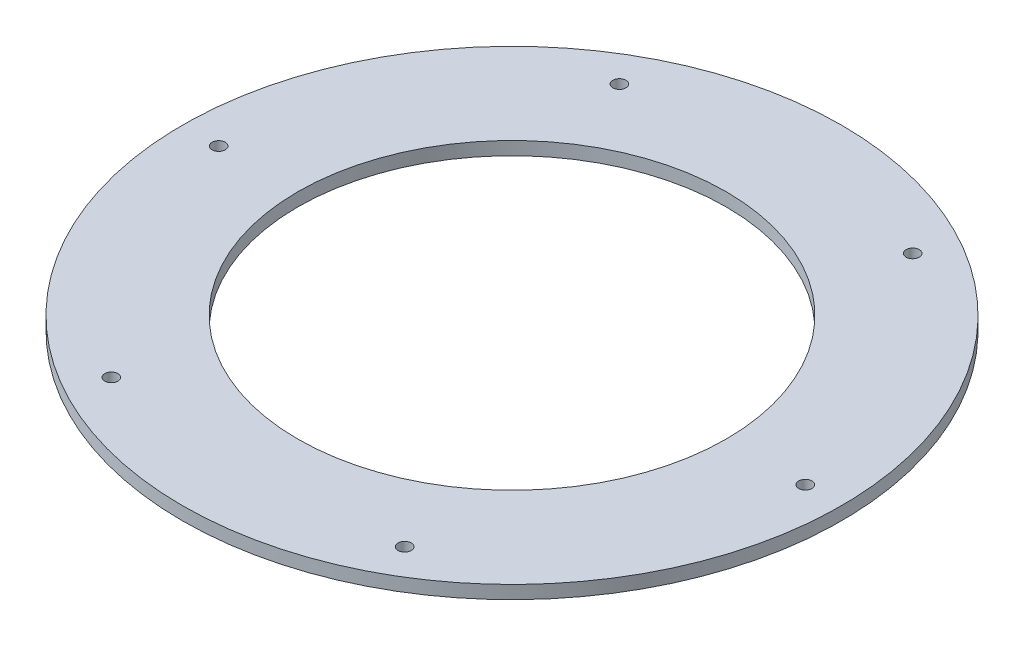
ISO-10303-21;
HEADER;
FILE_DESCRIPTION(('STEP AP214'),'2;1');
FILE_NAME('part.step','',(''),(''),'','','');
FILE_SCHEMA(('AUTOMOTIVE_DESIGN { 1 0 10303 214 1 1 1 1 }'));
ENDSEC;
DATA;
#1=APPLICATION_CONTEXT('core data for automotive mechanical design processes');
#2=APPLICATION_PROTOCOL_DEFINITION('international standard','automotive_design',2000,#1);
#3=PRODUCT_CONTEXT('',#1,'mechanical');
#4=PRODUCT('Part','Part','',(#3));
#5=PRODUCT_RELATED_PRODUCT_CATEGORY('part','',(#4));
#6=PRODUCT_DEFINITION_FORMATION('','',#4);
#7=PRODUCT_DEFINITION_CONTEXT('part definition',#1,'design');
#8=PRODUCT_DEFINITION('design','',#6,#7);
#9=PRODUCT_DEFINITION_SHAPE('','',#8);
#10=(LENGTH_UNIT() NAMED_UNIT(*) SI_UNIT(.MILLI.,.METRE.));
#11=(NAMED_UNIT(*) PLANE_ANGLE_UNIT() SI_UNIT($,.RADIAN.));
#12=(NAMED_UNIT(*) SI_UNIT($,.STERADIAN.) SOLID_ANGLE_UNIT());
#13=UNCERTAINTY_MEASURE_WITH_UNIT(LENGTH_MEASURE(1.E-05),#10,'distance_accuracy_value','');
#14=(GEOMETRIC_REPRESENTATION_CONTEXT(3) GLOBAL_UNCERTAINTY_ASSIGNED_CONTEXT((#13)) GLOBAL_UNIT_ASSIGNED_CONTEXT((#10,
#11,#12)) REPRESENTATION_CONTEXT('',''));
#15=CARTESIAN_POINT('',(0.,0.,0.));
#16=DIRECTION('',(0.,0.,1.));
#17=DIRECTION('',(1.,0.,0.));
#18=AXIS2_PLACEMENT_3D('',#15,#16,#17);
#19=CARTESIAN_POINT('',(0.,5.,0.));
#20=DIRECTION('',(0.,1.,0.));
#21=DIRECTION('',(0.,0.,1.));
#22=AXIS2_PLACEMENT_3D('',#19,#20,#21);
#23=PLANE('',#22);
#24=CARTESIAN_POINT('',(111.25,5.,192.690652342038));
#25=DIRECTION('',(0.,1.,0.));
#26=DIRECTION('',(0.,0.,-1.));
#27=AXIS2_PLACEMENT_3D('',#24,#25,#26);
#28=CIRCLE('',#27,5.00000000000002);
#29=CARTESIAN_POINT('',(111.25,5.,187.690652342038));
#30=VERTEX_POINT('',#29);
#31=EDGE_CURVE('E89',#30,#30,#28,.T.);
#32=ORIENTED_EDGE('',*,*,#31,.F.);
#33=EDGE_LOOP('',(#32));
#34=FACE_BOUND('',#33,.T.);
#35=CARTESIAN_POINT('',(-222.5,5.,1.55431223447522E-12));
#36=DIRECTION('',(0.,1.,0.));
#37=DIRECTION('',(0.,0.,-1.));
#38=AXIS2_PLACEMENT_3D('',#35,#36,#37);
#39=CIRCLE('',#38,4.99999999999993);
#40=CARTESIAN_POINT('',(-222.5,5.,-4.99999999999837));
#41=VERTEX_POINT('',#40);
#42=EDGE_CURVE('E98',#41,#41,#39,.T.);
#43=ORIENTED_EDGE('',*,*,#42,.F.);
#44=EDGE_LOOP('',(#43));
#45=FACE_BOUND('',#44,.T.);
#46=CARTESIAN_POINT('',(-111.250000000001,5.,-192.690652342037));
#47=DIRECTION('',(0.,1.,0.));
#48=DIRECTION('',(0.,0.,-1.));
#49=AXIS2_PLACEMENT_3D('',#46,#47,#48);
#50=CIRCLE('',#49,5.00000000000002);
#51=CARTESIAN_POINT('',(-111.250000000001,5.,-197.690652342037));
#52=VERTEX_POINT('',#51);
#53=EDGE_CURVE('E73',#52,#52,#50,.T.);
#54=ORIENTED_EDGE('',*,*,#53,.F.);
#55=EDGE_LOOP('',(#54));
#56=FACE_BOUND('',#55,.T.);
#57=CARTESIAN_POINT('',(222.5,5.,0.));
#58=DIRECTION('',(0.,1.,0.));
#59=DIRECTION('',(0.,0.,1.));
#60=AXIS2_PLACEMENT_3D('',#57,#58,#59);
#61=CIRCLE('',#60,4.99999999999999);
#62=CARTESIAN_POINT('',(222.5,5.,4.99999999999999));
#63=VERTEX_POINT('',#62);
#64=EDGE_CURVE('E82',#63,#63,#61,.T.);
#65=ORIENTED_EDGE('',*,*,#64,.F.);
#66=EDGE_LOOP('',(#65));
#67=FACE_BOUND('',#66,.T.);
#68=CARTESIAN_POINT('',(-111.250000000001,5.,192.690652342037));
#69=DIRECTION('',(0.,1.,0.));
#70=DIRECTION('',(0.,0.,1.));
#71=AXIS2_PLACEMENT_3D('',#68,#69,#70);
#72=CIRCLE('',#71,5.00000000000002);
#73=CARTESIAN_POINT('',(-111.250000000001,5.,197.690652342037));
#74=VERTEX_POINT('',#73);
#75=EDGE_CURVE('E105',#74,#74,#72,.T.);
#76=ORIENTED_EDGE('',*,*,#75,.F.);
#77=EDGE_LOOP('',(#76));
#78=FACE_BOUND('',#77,.T.);
#79=CARTESIAN_POINT('',(111.25,5.,-192.690652342038));
#80=DIRECTION('',(0.,1.,0.));
#81=DIRECTION('',(0.,0.,1.));
#82=AXIS2_PLACEMENT_3D('',#79,#80,#81);
#83=CIRCLE('',#82,5.00000000000002);
#84=CARTESIAN_POINT('',(111.25,5.,-187.690652342038));
#85=VERTEX_POINT('',#84);
#86=EDGE_CURVE('E65',#85,#85,#83,.T.);
#87=ORIENTED_EDGE('',*,*,#86,.F.);
#88=EDGE_LOOP('',(#87));
#89=FACE_BOUND('',#88,.T.);
#90=CARTESIAN_POINT('',(0.,5.,0.));
#91=DIRECTION('',(0.,1.,0.));
#92=DIRECTION('',(0.,0.,1.));
#93=AXIS2_PLACEMENT_3D('',#90,#91,#92);
#94=CIRCLE('',#93,250.);
#95=CARTESIAN_POINT('',(0.,5.,250.));
#96=VERTEX_POINT('',#95);
#97=EDGE_CURVE('E10',#96,#96,#94,.T.);
#98=ORIENTED_EDGE('',*,*,#97,.T.);
#99=EDGE_LOOP('',(#98));
#100=FACE_BOUND('',#99,.T.);
#101=CARTESIAN_POINT('',(0.,5.,0.));
#102=DIRECTION('',(0.,1.,0.));
#103=DIRECTION('',(0.,0.,1.));
#104=AXIS2_PLACEMENT_3D('',#101,#102,#103);
#105=CIRCLE('',#104,162.5);
#106=CARTESIAN_POINT('',(0.,5.,162.5));
#107=VERTEX_POINT('',#106);
#108=EDGE_CURVE('E55',#107,#107,#105,.T.);
#109=ORIENTED_EDGE('',*,*,#108,.F.);
#110=EDGE_LOOP('',(#109));
#111=FACE_BOUND('',#110,.T.);
#112=ADVANCED_FACE('F40',(#34,#45,#56,#67,#78,#89,#100,#111),#23,.T.);
#113=CARTESIAN_POINT('',(0.,-5.,0.));
#114=DIRECTION('',(0.,1.,0.));
#115=DIRECTION('',(0.,0.,1.));
#116=AXIS2_PLACEMENT_3D('',#113,#114,#115);
#117=PLANE('',#116);
#118=CARTESIAN_POINT('',(111.25,-5.,192.690652342038));
#119=DIRECTION('',(0.,1.,0.));
#120=DIRECTION('',(0.,0.,-1.));
#121=AXIS2_PLACEMENT_3D('',#118,#119,#120);
#122=CIRCLE('',#121,5.00000000000002);
#123=CARTESIAN_POINT('',(111.25,-5.,187.690652342038));
#124=VERTEX_POINT('',#123);
#125=EDGE_CURVE('E93',#124,#124,#122,.T.);
#126=ORIENTED_EDGE('',*,*,#125,.T.);
#127=EDGE_LOOP('',(#126));
#128=FACE_BOUND('',#127,.T.);
#129=CARTESIAN_POINT('',(-222.5,-5.,1.55431223447522E-12));
#130=DIRECTION('',(0.,1.,0.));
#131=DIRECTION('',(0.,0.,-1.));
#132=AXIS2_PLACEMENT_3D('',#129,#130,#131);
#133=CIRCLE('',#132,4.99999999999993);
#134=CARTESIAN_POINT('',(-222.5,-5.,-4.99999999999837));
#135=VERTEX_POINT('',#134);
#136=EDGE_CURVE('E78',#135,#135,#133,.T.);
#137=ORIENTED_EDGE('',*,*,#136,.T.);
#138=EDGE_LOOP('',(#137));
#139=FACE_BOUND('',#138,.T.);
#140=CARTESIAN_POINT('',(-111.250000000001,-5.,-192.690652342037));
#141=DIRECTION('',(0.,1.,0.));
#142=DIRECTION('',(0.,0.,-1.));
#143=AXIS2_PLACEMENT_3D('',#140,#141,#142);
#144=CIRCLE('',#143,5.00000000000002);
#145=CARTESIAN_POINT('',(-111.250000000001,-5.,-197.690652342037));
#146=VERTEX_POINT('',#145);
#147=EDGE_CURVE('E77',#146,#146,#144,.T.);
#148=ORIENTED_EDGE('',*,*,#147,.T.);
#149=EDGE_LOOP('',(#148));
#150=FACE_BOUND('',#149,.T.);
#151=CARTESIAN_POINT('',(222.5,-5.,0.));
#152=DIRECTION('',(0.,1.,0.));
#153=DIRECTION('',(0.,0.,1.));
#154=AXIS2_PLACEMENT_3D('',#151,#152,#153);
#155=CIRCLE('',#154,4.99999999999999);
#156=CARTESIAN_POINT('',(222.5,-5.,4.99999999999999));
#157=VERTEX_POINT('',#156);
#158=EDGE_CURVE('E69',#157,#157,#155,.T.);
#159=ORIENTED_EDGE('',*,*,#158,.T.);
#160=EDGE_LOOP('',(#159));
#161=FACE_BOUND('',#160,.T.);
#162=CARTESIAN_POINT('',(-111.250000000001,-5.,192.690652342037));
#163=DIRECTION('',(0.,1.,0.));
#164=DIRECTION('',(0.,0.,1.));
#165=AXIS2_PLACEMENT_3D('',#162,#163,#164);
#166=CIRCLE('',#165,5.00000000000002);
#167=CARTESIAN_POINT('',(-111.250000000001,-5.,197.690652342037));
#168=VERTEX_POINT('',#167);
#169=EDGE_CURVE('E94',#168,#168,#166,.T.);
#170=ORIENTED_EDGE('',*,*,#169,.T.);
#171=EDGE_LOOP('',(#170));
#172=FACE_BOUND('',#171,.T.);
#173=CARTESIAN_POINT('',(111.25,-5.,-192.690652342038));
#174=DIRECTION('',(0.,1.,0.));
#175=DIRECTION('',(0.,0.,1.));
#176=AXIS2_PLACEMENT_3D('',#173,#174,#175);
#177=CIRCLE('',#176,5.00000000000002);
#178=CARTESIAN_POINT('',(111.25,-5.,-187.690652342038));
#179=VERTEX_POINT('',#178);
#180=EDGE_CURVE('E61',#179,#179,#177,.T.);
#181=ORIENTED_EDGE('',*,*,#180,.T.);
#182=EDGE_LOOP('',(#181));
#183=FACE_BOUND('',#182,.T.);
#184=CARTESIAN_POINT('',(0.,-5.,0.));
#185=DIRECTION('',(0.,1.,0.));
#186=DIRECTION('',(0.,0.,1.));
#187=AXIS2_PLACEMENT_3D('',#184,#185,#186);
#188=CIRCLE('',#187,250.);
#189=CARTESIAN_POINT('',(0.,-5.,250.));
#190=VERTEX_POINT('',#189);
#191=EDGE_CURVE('E44',#190,#190,#188,.T.);
#192=ORIENTED_EDGE('',*,*,#191,.F.);
#193=EDGE_LOOP('',(#192));
#194=FACE_BOUND('',#193,.T.);
#195=CARTESIAN_POINT('',(0.,-5.,0.));
#196=DIRECTION('',(0.,1.,0.));
#197=DIRECTION('',(0.,0.,1.));
#198=AXIS2_PLACEMENT_3D('',#195,#196,#197);
#199=CIRCLE('',#198,162.5);
#200=CARTESIAN_POINT('',(0.,-5.,162.5));
#201=VERTEX_POINT('',#200);
#202=EDGE_CURVE('E57',#201,#201,#199,.T.);
#203=ORIENTED_EDGE('',*,*,#202,.T.);
#204=EDGE_LOOP('',(#203));
#205=FACE_BOUND('',#204,.T.);
#206=ADVANCED_FACE('F115',(#128,#139,#150,#161,#172,#183,#194,#205),#117,.F.);
#207=CARTESIAN_POINT('',(0.,5.,0.));
#208=DIRECTION('',(0.,-1.,0.));
#209=DIRECTION('',(0.,0.,-1.));
#210=AXIS2_PLACEMENT_3D('',#207,#208,#209);
#211=CYLINDRICAL_SURFACE('',#210,250.);
#212=ORIENTED_EDGE('',*,*,#97,.F.);
#213=EDGE_LOOP('',(#212));
#214=FACE_BOUND('',#213,.T.);
#215=ORIENTED_EDGE('',*,*,#191,.T.);
#216=EDGE_LOOP('',(#215));
#217=FACE_BOUND('',#216,.T.);
#218=ADVANCED_FACE('F42',(#214,#217),#211,.T.);
#219=CARTESIAN_POINT('',(0.,5.,0.));
#220=DIRECTION('',(0.,-1.,0.));
#221=DIRECTION('',(0.,0.,-1.));
#222=AXIS2_PLACEMENT_3D('',#219,#220,#221);
#223=CYLINDRICAL_SURFACE('',#222,162.5);
#224=ORIENTED_EDGE('',*,*,#108,.T.);
#225=EDGE_LOOP('',(#224));
#226=FACE_BOUND('',#225,.T.);
#227=ORIENTED_EDGE('',*,*,#202,.F.);
#228=EDGE_LOOP('',(#227));
#229=FACE_BOUND('',#228,.T.);
#230=ADVANCED_FACE('F134',(#226,#229),#223,.F.);
#231=CARTESIAN_POINT('',(111.25,-5.,-192.690652342038));
#232=DIRECTION('',(0.,1.,0.));
#233=DIRECTION('',(0.,0.,1.));
#234=AXIS2_PLACEMENT_3D('',#231,#232,#233);
#235=CYLINDRICAL_SURFACE('',#234,5.00000000000002);
#236=ORIENTED_EDGE('',*,*,#180,.F.);
#237=EDGE_LOOP('',(#236));
#238=FACE_BOUND('',#237,.T.);
#239=ORIENTED_EDGE('',*,*,#86,.T.);
#240=EDGE_LOOP('',(#239));
#241=FACE_BOUND('',#240,.T.);
#242=ADVANCED_FACE('F122',(#238,#241),#235,.F.);
#243=CARTESIAN_POINT('',(-111.250000000001,-5.,192.690652342037));
#244=DIRECTION('',(0.,1.,0.));
#245=DIRECTION('',(0.,0.,1.));
#246=AXIS2_PLACEMENT_3D('',#243,#244,#245);
#247=CYLINDRICAL_SURFACE('',#246,5.00000000000002);
#248=ORIENTED_EDGE('',*,*,#169,.F.);
#249=EDGE_LOOP('',(#248));
#250=FACE_BOUND('',#249,.T.);
#251=ORIENTED_EDGE('',*,*,#75,.T.);
#252=EDGE_LOOP('',(#251));
#253=FACE_BOUND('',#252,.T.);
#254=ADVANCED_FACE('F118',(#250,#253),#247,.F.);
#255=CARTESIAN_POINT('',(222.5,-5.,0.));
#256=DIRECTION('',(0.,1.,0.));
#257=DIRECTION('',(0.,0.,1.));
#258=AXIS2_PLACEMENT_3D('',#255,#256,#257);
#259=CYLINDRICAL_SURFACE('',#258,4.99999999999999);
#260=ORIENTED_EDGE('',*,*,#158,.F.);
#261=EDGE_LOOP('',(#260));
#262=FACE_BOUND('',#261,.T.);
#263=ORIENTED_EDGE('',*,*,#64,.T.);
#264=EDGE_LOOP('',(#263));
#265=FACE_BOUND('',#264,.T.);
#266=ADVANCED_FACE('F121',(#262,#265),#259,.F.);
#267=CARTESIAN_POINT('',(-111.250000000001,-5.,-192.690652342037));
#268=DIRECTION('',(0.,1.,0.));
#269=DIRECTION('',(0.,0.,1.));
#270=AXIS2_PLACEMENT_3D('',#267,#268,#269);
#271=CYLINDRICAL_SURFACE('',#270,5.00000000000002);
#272=ORIENTED_EDGE('',*,*,#147,.F.);
#273=EDGE_LOOP('',(#272));
#274=FACE_BOUND('',#273,.T.);
#275=ORIENTED_EDGE('',*,*,#53,.T.);
#276=EDGE_LOOP('',(#275));
#277=FACE_BOUND('',#276,.T.);
#278=ADVANCED_FACE('F151',(#274,#277),#271,.F.);
#279=CARTESIAN_POINT('',(-222.5,-5.,1.55431223447522E-12));
#280=DIRECTION('',(0.,1.,0.));
#281=DIRECTION('',(0.,0.,1.));
#282=AXIS2_PLACEMENT_3D('',#279,#280,#281);
#283=CYLINDRICAL_SURFACE('',#282,4.99999999999993);
#284=ORIENTED_EDGE('',*,*,#136,.F.);
#285=EDGE_LOOP('',(#284));
#286=FACE_BOUND('',#285,.T.);
#287=ORIENTED_EDGE('',*,*,#42,.T.);
#288=EDGE_LOOP('',(#287));
#289=FACE_BOUND('',#288,.T.);
#290=ADVANCED_FACE('F154',(#286,#289),#283,.F.);
#291=CARTESIAN_POINT('',(111.25,-5.,192.690652342038));
#292=DIRECTION('',(0.,1.,0.));
#293=DIRECTION('',(0.,0.,1.));
#294=AXIS2_PLACEMENT_3D('',#291,#292,#293);
#295=CYLINDRICAL_SURFACE('',#294,5.00000000000002);
#296=ORIENTED_EDGE('',*,*,#125,.F.);
#297=EDGE_LOOP('',(#296));
#298=FACE_BOUND('',#297,.T.);
#299=ORIENTED_EDGE('',*,*,#31,.T.);
#300=EDGE_LOOP('',(#299));
#301=FACE_BOUND('',#300,.T.);
#302=ADVANCED_FACE('F159',(#298,#301),#295,.F.);
#303=CLOSED_SHELL('',(#112,#206,#218,#230,#242,#254,#266,#278,#290,#302));
#304=MANIFOLD_SOLID_BREP('B2',#303);
#305=ADVANCED_BREP_SHAPE_REPRESENTATION('',(#18,#304),#14);
#306=SHAPE_DEFINITION_REPRESENTATION(#9,#305);
ENDSEC;
END-ISO-10303-21;
